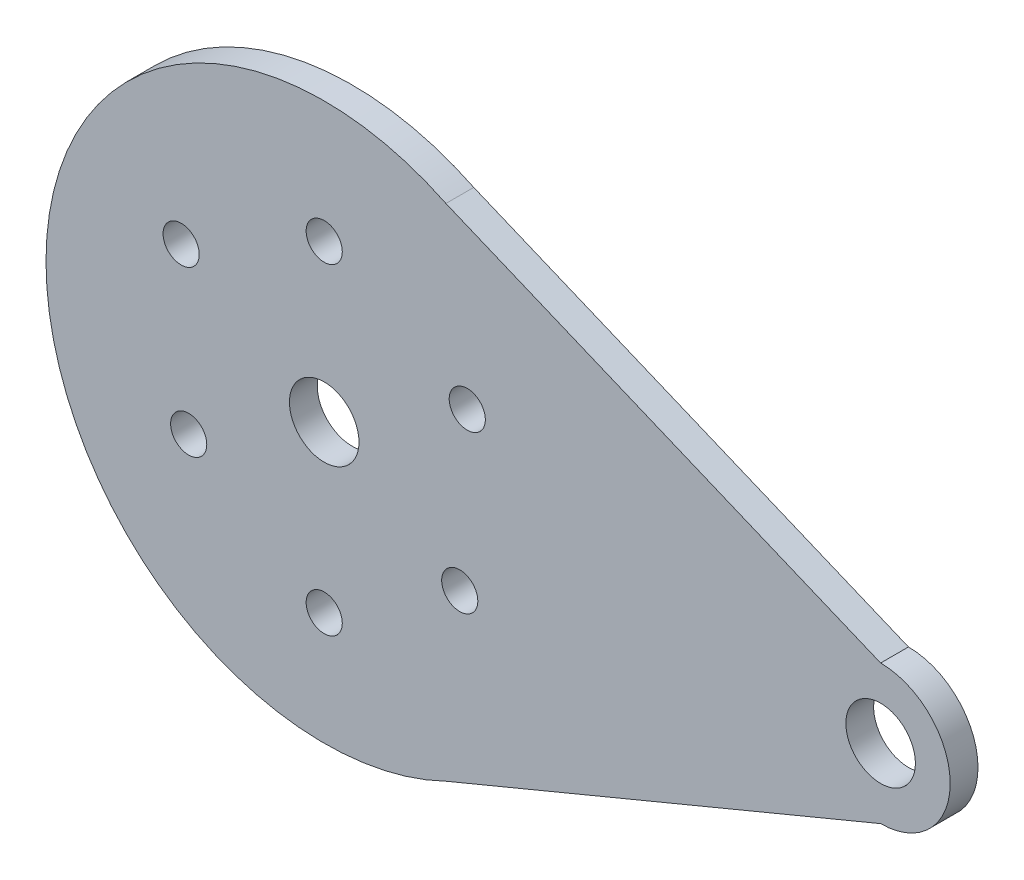
ISO-10303-21;
HEADER;
FILE_DESCRIPTION(('STEP AP214'),'2;1');
FILE_NAME('part.step','',(''),(''),'','','');
FILE_SCHEMA(('AUTOMOTIVE_DESIGN { 1 0 10303 214 1 1 1 1 }'));
ENDSEC;
DATA;
#1=APPLICATION_CONTEXT('core data for automotive mechanical design processes');
#2=APPLICATION_PROTOCOL_DEFINITION('international standard','automotive_design',2000,#1);
#3=PRODUCT_CONTEXT('',#1,'mechanical');
#4=PRODUCT('Part','Part','',(#3));
#5=PRODUCT_RELATED_PRODUCT_CATEGORY('part','',(#4));
#6=PRODUCT_DEFINITION_FORMATION('','',#4);
#7=PRODUCT_DEFINITION_CONTEXT('part definition',#1,'design');
#8=PRODUCT_DEFINITION('design','',#6,#7);
#9=PRODUCT_DEFINITION_SHAPE('','',#8);
#10=(LENGTH_UNIT() NAMED_UNIT(*) SI_UNIT(.MILLI.,.METRE.));
#11=(NAMED_UNIT(*) PLANE_ANGLE_UNIT() SI_UNIT($,.RADIAN.));
#12=(NAMED_UNIT(*) SI_UNIT($,.STERADIAN.) SOLID_ANGLE_UNIT());
#13=UNCERTAINTY_MEASURE_WITH_UNIT(LENGTH_MEASURE(1.E-05),#10,'distance_accuracy_value','');
#14=(GEOMETRIC_REPRESENTATION_CONTEXT(3) GLOBAL_UNCERTAINTY_ASSIGNED_CONTEXT((#13)) GLOBAL_UNIT_ASSIGNED_CONTEXT((#10,
#11,#12)) REPRESENTATION_CONTEXT('',''));
#15=CARTESIAN_POINT('',(0.,0.,0.));
#16=DIRECTION('',(0.,0.,1.));
#17=DIRECTION('',(1.,0.,0.));
#18=AXIS2_PLACEMENT_3D('',#15,#16,#17);
#19=CARTESIAN_POINT('',(0.386574367268539,-1.03149578118859,4.));
#20=DIRECTION('',(0.,0.,1.));
#21=DIRECTION('',(1.,0.,0.));
#22=AXIS2_PLACEMENT_3D('',#19,#20,#21);
#23=PLANE('',#22);
#24=CARTESIAN_POINT('',(0.386574367268584,-1.03149578118858,4.));
#25=DIRECTION('',(0.,0.,1.));
#26=DIRECTION('',(1.,0.,0.));
#27=AXIS2_PLACEMENT_3D('',#24,#25,#26);
#28=CIRCLE('',#27,5.);
#29=CARTESIAN_POINT('',(5.38657436726858,-1.03149578118858,4.));
#30=VERTEX_POINT('',#29);
#31=EDGE_CURVE('E174',#30,#30,#28,.T.);
#32=ORIENTED_EDGE('',*,*,#31,.F.);
#33=EDGE_LOOP('',(#32));
#34=FACE_BOUND('',#33,.T.);
#35=CARTESIAN_POINT('',(-19.0989972178813,-12.2814957811885,4.));
#36=DIRECTION('',(0.,0.,1.));
#37=DIRECTION('',(1.,0.,0.));
#38=AXIS2_PLACEMENT_3D('',#35,#36,#37);
#39=CIRCLE('',#38,2.6);
#40=CARTESIAN_POINT('',(-16.4989972178813,-12.2814957811885,4.));
#41=VERTEX_POINT('',#40);
#42=EDGE_CURVE('E158',#41,#41,#39,.T.);
#43=ORIENTED_EDGE('',*,*,#42,.F.);
#44=EDGE_LOOP('',(#43));
#45=FACE_BOUND('',#44,.T.);
#46=CARTESIAN_POINT('',(-20.1815289726118,10.8435042188115,4.));
#47=DIRECTION('',(0.,0.,1.));
#48=DIRECTION('',(1.,0.,0.));
#49=AXIS2_PLACEMENT_3D('',#46,#47,#48);
#50=CIRCLE('',#49,2.6);
#51=CARTESIAN_POINT('',(-17.5815289726118,10.8435042188115,4.));
#52=VERTEX_POINT('',#51);
#53=EDGE_CURVE('E142',#52,#52,#50,.T.);
#54=ORIENTED_EDGE('',*,*,#53,.F.);
#55=EDGE_LOOP('',(#54));
#56=FACE_BOUND('',#55,.T.);
#57=CARTESIAN_POINT('',(0.386574367268584,-24.7814957811886,4.));
#58=DIRECTION('',(0.,0.,1.));
#59=DIRECTION('',(1.,0.,0.));
#60=AXIS2_PLACEMENT_3D('',#57,#58,#59);
#61=CIRCLE('',#60,2.6);
#62=CARTESIAN_POINT('',(2.98657436726859,-24.7814957811886,4.));
#63=VERTEX_POINT('',#62);
#64=EDGE_CURVE('E112',#63,#63,#61,.T.);
#65=ORIENTED_EDGE('',*,*,#64,.F.);
#66=EDGE_LOOP('',(#65));
#67=FACE_BOUND('',#66,.T.);
#68=CARTESIAN_POINT('',(0.386574367268539,-1.03149578118859,4.));
#69=DIRECTION('',(0.,0.,1.));
#70=DIRECTION('',(1.,0.,0.));
#71=AXIS2_PLACEMENT_3D('',#68,#69,#70);
#72=CIRCLE('',#71,40.);
#73=CARTESIAN_POINT('',(17.8865743672686,34.9372406436568,4.));
#74=VERTEX_POINT('',#73);
#75=CARTESIAN_POINT('',(17.8865743672686,-37.000232206034,4.));
#76=VERTEX_POINT('',#75);
#77=EDGE_CURVE('E92',#74,#76,#72,.T.);
#78=ORIENTED_EDGE('',*,*,#77,.T.);
#79=DIRECTION('',(0.923459035472841,0.383697028661378,0.));
#80=VECTOR('',#79,1.);
#81=CARTESIAN_POINT('',(17.8865743672686,-37.000232206034,4.));
#82=LINE('',#81,#80);
#83=CARTESIAN_POINT('',(80.3865743672687,-11.0314957811886,4.));
#84=VERTEX_POINT('',#83);
#85=EDGE_CURVE('E87',#76,#84,#82,.T.);
#86=ORIENTED_EDGE('',*,*,#85,.T.);
#87=CARTESIAN_POINT('',(80.3865743672686,-1.03149578118858,4.));
#88=DIRECTION('',(0.,0.,1.));
#89=DIRECTION('',(-1.,0.,0.));
#90=AXIS2_PLACEMENT_3D('',#87,#88,#89);
#91=CIRCLE('',#90,9.99999999999999);
#92=CARTESIAN_POINT('',(80.3865743672687,8.96850421881142,4.));
#93=VERTEX_POINT('',#92);
#94=EDGE_CURVE('E90',#84,#93,#91,.T.);
#95=ORIENTED_EDGE('',*,*,#94,.T.);
#96=DIRECTION('',(-0.923459035472841,0.383697028661378,0.));
#97=VECTOR('',#96,1.);
#98=CARTESIAN_POINT('',(17.8865743672686,34.9372406436568,4.));
#99=LINE('',#98,#97);
#100=EDGE_CURVE('E57',#93,#74,#99,.T.);
#101=ORIENTED_EDGE('',*,*,#100,.T.);
#102=EDGE_LOOP('',(#78,#86,#95,#101));
#103=FACE_BOUND('',#102,.T.);
#104=CARTESIAN_POINT('',(19.8721459524184,-12.2814957811886,4.));
#105=DIRECTION('',(0.,0.,1.));
#106=DIRECTION('',(1.,0.,0.));
#107=AXIS2_PLACEMENT_3D('',#104,#105,#106);
#108=CIRCLE('',#107,2.59999999999999);
#109=CARTESIAN_POINT('',(22.4721459524184,-12.2814957811886,4.));
#110=VERTEX_POINT('',#109);
#111=EDGE_CURVE('E134',#110,#110,#108,.T.);
#112=ORIENTED_EDGE('',*,*,#111,.F.);
#113=EDGE_LOOP('',(#112));
#114=FACE_BOUND('',#113,.T.);
#115=CARTESIAN_POINT('',(20.9546777071491,10.8435042188112,4.));
#116=DIRECTION('',(0.,0.,1.));
#117=DIRECTION('',(1.,0.,0.));
#118=AXIS2_PLACEMENT_3D('',#115,#116,#117);
#119=CIRCLE('',#118,2.6);
#120=CARTESIAN_POINT('',(23.5546777071491,10.8435042188112,4.));
#121=VERTEX_POINT('',#120);
#122=EDGE_CURVE('E150',#121,#121,#119,.T.);
#123=ORIENTED_EDGE('',*,*,#122,.F.);
#124=EDGE_LOOP('',(#123));
#125=FACE_BOUND('',#124,.T.);
#126=CARTESIAN_POINT('',(0.386574367268805,21.4685042188114,4.));
#127=DIRECTION('',(0.,0.,1.));
#128=DIRECTION('',(1.,0.,0.));
#129=AXIS2_PLACEMENT_3D('',#126,#127,#128);
#130=CIRCLE('',#129,2.6);
#131=CARTESIAN_POINT('',(2.9865743672688,21.4685042188114,4.));
#132=VERTEX_POINT('',#131);
#133=EDGE_CURVE('E166',#132,#132,#130,.T.);
#134=ORIENTED_EDGE('',*,*,#133,.F.);
#135=EDGE_LOOP('',(#134));
#136=FACE_BOUND('',#135,.T.);
#137=CARTESIAN_POINT('',(80.3865743672687,-1.03149578118858,4.));
#138=DIRECTION('',(0.,0.,1.));
#139=DIRECTION('',(1.,0.,0.));
#140=AXIS2_PLACEMENT_3D('',#137,#138,#139);
#141=CIRCLE('',#140,5.);
#142=CARTESIAN_POINT('',(85.3865743672687,-1.03149578118858,4.));
#143=VERTEX_POINT('',#142);
#144=EDGE_CURVE('E182',#143,#143,#141,.T.);
#145=ORIENTED_EDGE('',*,*,#144,.F.);
#146=EDGE_LOOP('',(#145));
#147=FACE_BOUND('',#146,.T.);
#148=ADVANCED_FACE('F39',(#34,#45,#56,#67,#103,#114,#125,#136,#147),#23,.T.);
#149=CARTESIAN_POINT('',(0.386574367268539,-1.03149578118859,0.));
#150=DIRECTION('',(0.,0.,1.));
#151=DIRECTION('',(1.,0.,0.));
#152=AXIS2_PLACEMENT_3D('',#149,#150,#151);
#153=PLANE('',#152);
#154=CARTESIAN_POINT('',(0.386574367268539,-1.03149578118859,0.));
#155=DIRECTION('',(0.,0.,1.));
#156=DIRECTION('',(1.,0.,0.));
#157=AXIS2_PLACEMENT_3D('',#154,#155,#156);
#158=CIRCLE('',#157,40.);
#159=CARTESIAN_POINT('',(17.8865743672686,34.9372406436568,0.));
#160=VERTEX_POINT('',#159);
#161=CARTESIAN_POINT('',(17.8865743672686,-37.000232206034,0.));
#162=VERTEX_POINT('',#161);
#163=EDGE_CURVE('E108',#160,#162,#158,.T.);
#164=ORIENTED_EDGE('',*,*,#163,.F.);
#165=DIRECTION('',(-0.923459035472841,0.383697028661378,0.));
#166=VECTOR('',#165,1.);
#167=CARTESIAN_POINT('',(17.8865743672686,34.9372406436568,0.));
#168=LINE('',#167,#166);
#169=CARTESIAN_POINT('',(80.3865743672687,8.96850421881142,0.));
#170=VERTEX_POINT('',#169);
#171=EDGE_CURVE('E80',#170,#160,#168,.T.);
#172=ORIENTED_EDGE('',*,*,#171,.F.);
#173=CARTESIAN_POINT('',(80.3865743672686,-1.03149578118858,0.));
#174=DIRECTION('',(0.,0.,1.));
#175=DIRECTION('',(-1.,0.,0.));
#176=AXIS2_PLACEMENT_3D('',#173,#174,#175);
#177=CIRCLE('',#176,9.99999999999999);
#178=CARTESIAN_POINT('',(80.3865743672687,-11.0314957811886,0.));
#179=VERTEX_POINT('',#178);
#180=EDGE_CURVE('E74',#179,#170,#177,.T.);
#181=ORIENTED_EDGE('',*,*,#180,.F.);
#182=DIRECTION('',(0.923459035472841,0.383697028661378,0.));
#183=VECTOR('',#182,1.);
#184=CARTESIAN_POINT('',(17.8865743672686,-37.000232206034,0.));
#185=LINE('',#184,#183);
#186=EDGE_CURVE('E97',#162,#179,#185,.T.);
#187=ORIENTED_EDGE('',*,*,#186,.F.);
#188=EDGE_LOOP('',(#164,#172,#181,#187));
#189=FACE_BOUND('',#188,.T.);
#190=CARTESIAN_POINT('',(0.386574367268584,-24.7814957811886,0.));
#191=DIRECTION('',(0.,0.,1.));
#192=DIRECTION('',(1.,0.,0.));
#193=AXIS2_PLACEMENT_3D('',#190,#191,#192);
#194=CIRCLE('',#193,2.6);
#195=CARTESIAN_POINT('',(2.98657436726859,-24.7814957811886,0.));
#196=VERTEX_POINT('',#195);
#197=EDGE_CURVE('E130',#196,#196,#194,.T.);
#198=ORIENTED_EDGE('',*,*,#197,.T.);
#199=EDGE_LOOP('',(#198));
#200=FACE_BOUND('',#199,.T.);
#201=CARTESIAN_POINT('',(19.8721459524184,-12.2814957811886,0.));
#202=DIRECTION('',(0.,0.,1.));
#203=DIRECTION('',(1.,0.,0.));
#204=AXIS2_PLACEMENT_3D('',#201,#202,#203);
#205=CIRCLE('',#204,2.59999999999999);
#206=CARTESIAN_POINT('',(22.4721459524184,-12.2814957811886,0.));
#207=VERTEX_POINT('',#206);
#208=EDGE_CURVE('E138',#207,#207,#205,.T.);
#209=ORIENTED_EDGE('',*,*,#208,.T.);
#210=EDGE_LOOP('',(#209));
#211=FACE_BOUND('',#210,.T.);
#212=CARTESIAN_POINT('',(-20.1815289726118,10.8435042188115,0.));
#213=DIRECTION('',(0.,0.,1.));
#214=DIRECTION('',(1.,0.,0.));
#215=AXIS2_PLACEMENT_3D('',#212,#213,#214);
#216=CIRCLE('',#215,2.6);
#217=CARTESIAN_POINT('',(-17.5815289726118,10.8435042188115,0.));
#218=VERTEX_POINT('',#217);
#219=EDGE_CURVE('E146',#218,#218,#216,.T.);
#220=ORIENTED_EDGE('',*,*,#219,.T.);
#221=EDGE_LOOP('',(#220));
#222=FACE_BOUND('',#221,.T.);
#223=CARTESIAN_POINT('',(20.9546777071491,10.8435042188112,0.));
#224=DIRECTION('',(0.,0.,1.));
#225=DIRECTION('',(1.,0.,0.));
#226=AXIS2_PLACEMENT_3D('',#223,#224,#225);
#227=CIRCLE('',#226,2.6);
#228=CARTESIAN_POINT('',(23.5546777071491,10.8435042188112,0.));
#229=VERTEX_POINT('',#228);
#230=EDGE_CURVE('E154',#229,#229,#227,.T.);
#231=ORIENTED_EDGE('',*,*,#230,.T.);
#232=EDGE_LOOP('',(#231));
#233=FACE_BOUND('',#232,.T.);
#234=CARTESIAN_POINT('',(-19.0989972178813,-12.2814957811885,0.));
#235=DIRECTION('',(0.,0.,1.));
#236=DIRECTION('',(1.,0.,0.));
#237=AXIS2_PLACEMENT_3D('',#234,#235,#236);
#238=CIRCLE('',#237,2.6);
#239=CARTESIAN_POINT('',(-16.4989972178813,-12.2814957811885,0.));
#240=VERTEX_POINT('',#239);
#241=EDGE_CURVE('E162',#240,#240,#238,.T.);
#242=ORIENTED_EDGE('',*,*,#241,.T.);
#243=EDGE_LOOP('',(#242));
#244=FACE_BOUND('',#243,.T.);
#245=CARTESIAN_POINT('',(0.386574367268805,21.4685042188114,0.));
#246=DIRECTION('',(0.,0.,1.));
#247=DIRECTION('',(1.,0.,0.));
#248=AXIS2_PLACEMENT_3D('',#245,#246,#247);
#249=CIRCLE('',#248,2.6);
#250=CARTESIAN_POINT('',(2.9865743672688,21.4685042188114,0.));
#251=VERTEX_POINT('',#250);
#252=EDGE_CURVE('E170',#251,#251,#249,.T.);
#253=ORIENTED_EDGE('',*,*,#252,.T.);
#254=EDGE_LOOP('',(#253));
#255=FACE_BOUND('',#254,.T.);
#256=CARTESIAN_POINT('',(0.386574367268584,-1.03149578118858,0.));
#257=DIRECTION('',(0.,0.,1.));
#258=DIRECTION('',(1.,0.,0.));
#259=AXIS2_PLACEMENT_3D('',#256,#257,#258);
#260=CIRCLE('',#259,5.);
#261=CARTESIAN_POINT('',(5.38657436726858,-1.03149578118858,0.));
#262=VERTEX_POINT('',#261);
#263=EDGE_CURVE('E178',#262,#262,#260,.T.);
#264=ORIENTED_EDGE('',*,*,#263,.T.);
#265=EDGE_LOOP('',(#264));
#266=FACE_BOUND('',#265,.T.);
#267=CARTESIAN_POINT('',(80.3865743672687,-1.03149578118858,0.));
#268=DIRECTION('',(0.,0.,1.));
#269=DIRECTION('',(1.,0.,0.));
#270=AXIS2_PLACEMENT_3D('',#267,#268,#269);
#271=CIRCLE('',#270,5.);
#272=CARTESIAN_POINT('',(85.3865743672687,-1.03149578118858,0.));
#273=VERTEX_POINT('',#272);
#274=EDGE_CURVE('E186',#273,#273,#271,.T.);
#275=ORIENTED_EDGE('',*,*,#274,.T.);
#276=EDGE_LOOP('',(#275));
#277=FACE_BOUND('',#276,.T.);
#278=ADVANCED_FACE('F125',(#189,#200,#211,#222,#233,#244,#255,#266,#277),#153,.F.);
#279=CARTESIAN_POINT('',(0.386574367268539,-1.03149578118859,4.));
#280=DIRECTION('',(0.,0.,-1.));
#281=DIRECTION('',(-1.,0.,0.));
#282=AXIS2_PLACEMENT_3D('',#279,#280,#281);
#283=CYLINDRICAL_SURFACE('',#282,40.);
#284=ORIENTED_EDGE('',*,*,#163,.T.);
#285=DIRECTION('',(0.,0.,-1.));
#286=VECTOR('',#285,1.);
#287=CARTESIAN_POINT('',(17.8865743672686,-37.000232206034,4.));
#288=LINE('',#287,#286);
#289=EDGE_CURVE('E11',#76,#162,#288,.T.);
#290=ORIENTED_EDGE('',*,*,#289,.F.);
#291=ORIENTED_EDGE('',*,*,#77,.F.);
#292=DIRECTION('',(0.,0.,-1.));
#293=VECTOR('',#292,1.);
#294=CARTESIAN_POINT('',(17.8865743672686,34.9372406436568,4.));
#295=LINE('',#294,#293);
#296=EDGE_CURVE('E104',#74,#160,#295,.T.);
#297=ORIENTED_EDGE('',*,*,#296,.T.);
#298=EDGE_LOOP('',(#284,#290,#291,#297));
#299=FACE_BOUND('',#298,.T.);
#300=ADVANCED_FACE('F41',(#299),#283,.T.);
#301=CARTESIAN_POINT('',(17.8865743672686,-37.000232206034,4.));
#302=DIRECTION('',(-0.383697028661378,0.923459035472841,0.));
#303=DIRECTION('',(-0.923459035472841,-0.383697028661378,0.));
#304=AXIS2_PLACEMENT_3D('',#301,#302,#303);
#305=PLANE('',#304);
#306=ORIENTED_EDGE('',*,*,#186,.T.);
#307=DIRECTION('',(0.,0.,-1.));
#308=VECTOR('',#307,1.);
#309=CARTESIAN_POINT('',(80.3865743672687,-11.0314957811886,4.));
#310=LINE('',#309,#308);
#311=EDGE_CURVE('E49',#84,#179,#310,.T.);
#312=ORIENTED_EDGE('',*,*,#311,.F.);
#313=ORIENTED_EDGE('',*,*,#85,.F.);
#314=ORIENTED_EDGE('',*,*,#289,.T.);
#315=EDGE_LOOP('',(#306,#312,#313,#314));
#316=FACE_BOUND('',#315,.T.);
#317=ADVANCED_FACE('F96',(#316),#305,.F.);
#318=CARTESIAN_POINT('',(80.3865743672686,-1.03149578118858,4.));
#319=DIRECTION('',(0.,0.,-1.));
#320=DIRECTION('',(-1.,0.,0.));
#321=AXIS2_PLACEMENT_3D('',#318,#319,#320);
#322=CYLINDRICAL_SURFACE('',#321,9.99999999999999);
#323=ORIENTED_EDGE('',*,*,#180,.T.);
#324=DIRECTION('',(0.,0.,-1.));
#325=VECTOR('',#324,1.);
#326=CARTESIAN_POINT('',(80.3865743672687,8.96850421881142,4.));
#327=LINE('',#326,#325);
#328=EDGE_CURVE('E99',#93,#170,#327,.T.);
#329=ORIENTED_EDGE('',*,*,#328,.F.);
#330=ORIENTED_EDGE('',*,*,#94,.F.);
#331=ORIENTED_EDGE('',*,*,#311,.T.);
#332=EDGE_LOOP('',(#323,#329,#330,#331));
#333=FACE_BOUND('',#332,.T.);
#334=ADVANCED_FACE('F100',(#333),#322,.T.);
#335=CARTESIAN_POINT('',(17.8865743672686,34.9372406436568,4.));
#336=DIRECTION('',(-0.383697028661378,-0.923459035472841,0.));
#337=DIRECTION('',(0.923459035472841,-0.383697028661378,0.));
#338=AXIS2_PLACEMENT_3D('',#335,#336,#337);
#339=PLANE('',#338);
#340=ORIENTED_EDGE('',*,*,#171,.T.);
#341=ORIENTED_EDGE('',*,*,#296,.F.);
#342=ORIENTED_EDGE('',*,*,#100,.F.);
#343=ORIENTED_EDGE('',*,*,#328,.T.);
#344=EDGE_LOOP('',(#340,#341,#342,#343));
#345=FACE_BOUND('',#344,.T.);
#346=ADVANCED_FACE('F122',(#345),#339,.F.);
#347=CARTESIAN_POINT('',(0.386574367268584,-24.7814957811886,4.));
#348=DIRECTION('',(0.,0.,-1.));
#349=DIRECTION('',(-1.,0.,0.));
#350=AXIS2_PLACEMENT_3D('',#347,#348,#349);
#351=CYLINDRICAL_SURFACE('',#350,2.6);
#352=ORIENTED_EDGE('',*,*,#64,.T.);
#353=EDGE_LOOP('',(#352));
#354=FACE_BOUND('',#353,.T.);
#355=ORIENTED_EDGE('',*,*,#197,.F.);
#356=EDGE_LOOP('',(#355));
#357=FACE_BOUND('',#356,.T.);
#358=ADVANCED_FACE('F207',(#354,#357),#351,.F.);
#359=CARTESIAN_POINT('',(19.8721459524184,-12.2814957811886,4.));
#360=DIRECTION('',(0.,0.,-1.));
#361=DIRECTION('',(-1.,0.,0.));
#362=AXIS2_PLACEMENT_3D('',#359,#360,#361);
#363=CYLINDRICAL_SURFACE('',#362,2.59999999999999);
#364=ORIENTED_EDGE('',*,*,#111,.T.);
#365=EDGE_LOOP('',(#364));
#366=FACE_BOUND('',#365,.T.);
#367=ORIENTED_EDGE('',*,*,#208,.F.);
#368=EDGE_LOOP('',(#367));
#369=FACE_BOUND('',#368,.T.);
#370=ADVANCED_FACE('F253',(#366,#369),#363,.F.);
#371=CARTESIAN_POINT('',(-20.1815289726118,10.8435042188115,4.));
#372=DIRECTION('',(0.,0.,-1.));
#373=DIRECTION('',(-1.,0.,0.));
#374=AXIS2_PLACEMENT_3D('',#371,#372,#373);
#375=CYLINDRICAL_SURFACE('',#374,2.6);
#376=ORIENTED_EDGE('',*,*,#53,.T.);
#377=EDGE_LOOP('',(#376));
#378=FACE_BOUND('',#377,.T.);
#379=ORIENTED_EDGE('',*,*,#219,.F.);
#380=EDGE_LOOP('',(#379));
#381=FACE_BOUND('',#380,.T.);
#382=ADVANCED_FACE('F261',(#378,#381),#375,.F.);
#383=CARTESIAN_POINT('',(20.9546777071491,10.8435042188112,4.));
#384=DIRECTION('',(0.,0.,-1.));
#385=DIRECTION('',(-1.,0.,0.));
#386=AXIS2_PLACEMENT_3D('',#383,#384,#385);
#387=CYLINDRICAL_SURFACE('',#386,2.6);
#388=ORIENTED_EDGE('',*,*,#122,.T.);
#389=EDGE_LOOP('',(#388));
#390=FACE_BOUND('',#389,.T.);
#391=ORIENTED_EDGE('',*,*,#230,.F.);
#392=EDGE_LOOP('',(#391));
#393=FACE_BOUND('',#392,.T.);
#394=ADVANCED_FACE('F269',(#390,#393),#387,.F.);
#395=CARTESIAN_POINT('',(-19.0989972178813,-12.2814957811885,4.));
#396=DIRECTION('',(0.,0.,-1.));
#397=DIRECTION('',(-1.,0.,0.));
#398=AXIS2_PLACEMENT_3D('',#395,#396,#397);
#399=CYLINDRICAL_SURFACE('',#398,2.6);
#400=ORIENTED_EDGE('',*,*,#42,.T.);
#401=EDGE_LOOP('',(#400));
#402=FACE_BOUND('',#401,.T.);
#403=ORIENTED_EDGE('',*,*,#241,.F.);
#404=EDGE_LOOP('',(#403));
#405=FACE_BOUND('',#404,.T.);
#406=ADVANCED_FACE('F278',(#402,#405),#399,.F.);
#407=CARTESIAN_POINT('',(0.386574367268805,21.4685042188114,4.));
#408=DIRECTION('',(0.,0.,-1.));
#409=DIRECTION('',(-1.,0.,0.));
#410=AXIS2_PLACEMENT_3D('',#407,#408,#409);
#411=CYLINDRICAL_SURFACE('',#410,2.6);
#412=ORIENTED_EDGE('',*,*,#133,.T.);
#413=EDGE_LOOP('',(#412));
#414=FACE_BOUND('',#413,.T.);
#415=ORIENTED_EDGE('',*,*,#252,.F.);
#416=EDGE_LOOP('',(#415));
#417=FACE_BOUND('',#416,.T.);
#418=ADVANCED_FACE('F287',(#414,#417),#411,.F.);
#419=CARTESIAN_POINT('',(0.386574367268584,-1.03149578118858,4.));
#420=DIRECTION('',(0.,0.,-1.));
#421=DIRECTION('',(-1.,0.,0.));
#422=AXIS2_PLACEMENT_3D('',#419,#420,#421);
#423=CYLINDRICAL_SURFACE('',#422,5.);
#424=ORIENTED_EDGE('',*,*,#31,.T.);
#425=EDGE_LOOP('',(#424));
#426=FACE_BOUND('',#425,.T.);
#427=ORIENTED_EDGE('',*,*,#263,.F.);
#428=EDGE_LOOP('',(#427));
#429=FACE_BOUND('',#428,.T.);
#430=ADVANCED_FACE('F296',(#426,#429),#423,.F.);
#431=CARTESIAN_POINT('',(80.3865743672687,-1.03149578118858,4.));
#432=DIRECTION('',(0.,0.,-1.));
#433=DIRECTION('',(-1.,0.,0.));
#434=AXIS2_PLACEMENT_3D('',#431,#432,#433);
#435=CYLINDRICAL_SURFACE('',#434,5.);
#436=ORIENTED_EDGE('',*,*,#144,.T.);
#437=EDGE_LOOP('',(#436));
#438=FACE_BOUND('',#437,.T.);
#439=ORIENTED_EDGE('',*,*,#274,.F.);
#440=EDGE_LOOP('',(#439));
#441=FACE_BOUND('',#440,.T.);
#442=ADVANCED_FACE('F194',(#438,#441),#435,.F.);
#443=CLOSED_SHELL('',(#148,#278,#300,#317,#334,#346,#358,#370,#382,#394,#406,#418,#430,#442));
#444=MANIFOLD_SOLID_BREP('B2',#443);
#445=ADVANCED_BREP_SHAPE_REPRESENTATION('',(#18,#444),#14);
#446=SHAPE_DEFINITION_REPRESENTATION(#9,#445);
ENDSEC;
END-ISO-10303-21;
